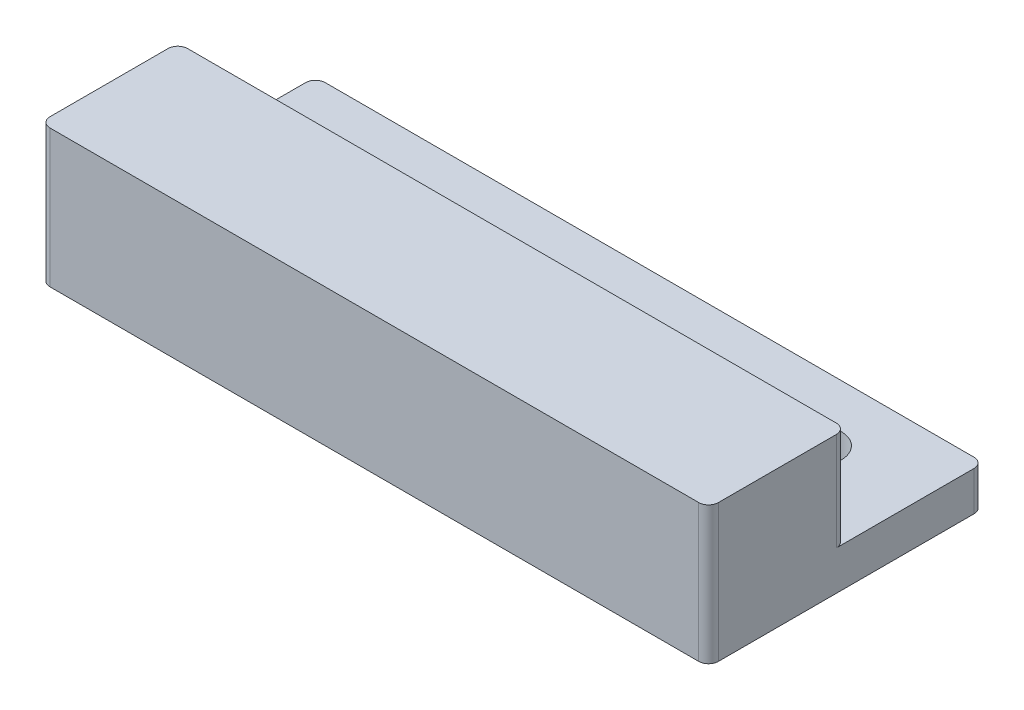
ISO-10303-21;
HEADER;
FILE_DESCRIPTION(('STEP AP214'),'2;1');
FILE_NAME('part.step','',(''),(''),'','','');
FILE_SCHEMA(('AUTOMOTIVE_DESIGN { 1 0 10303 214 1 1 1 1 }'));
ENDSEC;
DATA;
#1=APPLICATION_CONTEXT('core data for automotive mechanical design processes');
#2=APPLICATION_PROTOCOL_DEFINITION('international standard','automotive_design',2000,#1);
#3=PRODUCT_CONTEXT('',#1,'mechanical');
#4=PRODUCT('Part','Part','',(#3));
#5=PRODUCT_RELATED_PRODUCT_CATEGORY('part','',(#4));
#6=PRODUCT_DEFINITION_FORMATION('','',#4);
#7=PRODUCT_DEFINITION_CONTEXT('part definition',#1,'design');
#8=PRODUCT_DEFINITION('design','',#6,#7);
#9=PRODUCT_DEFINITION_SHAPE('','',#8);
#10=(LENGTH_UNIT() NAMED_UNIT(*) SI_UNIT(.MILLI.,.METRE.));
#11=(NAMED_UNIT(*) PLANE_ANGLE_UNIT() SI_UNIT($,.RADIAN.));
#12=(NAMED_UNIT(*) SI_UNIT($,.STERADIAN.) SOLID_ANGLE_UNIT());
#13=UNCERTAINTY_MEASURE_WITH_UNIT(LENGTH_MEASURE(1.E-05),#10,'distance_accuracy_value','');
#14=(GEOMETRIC_REPRESENTATION_CONTEXT(3) GLOBAL_UNCERTAINTY_ASSIGNED_CONTEXT((#13)) GLOBAL_UNIT_ASSIGNED_CONTEXT((#10,
#11,#12)) REPRESENTATION_CONTEXT('',''));
#15=CARTESIAN_POINT('',(0.,0.,0.));
#16=DIRECTION('',(0.,0.,1.));
#17=DIRECTION('',(1.,0.,0.));
#18=AXIS2_PLACEMENT_3D('',#15,#16,#17);
#19=CARTESIAN_POINT('',(17.,2.,-7.));
#20=DIRECTION('',(-1.,0.,0.));
#21=DIRECTION('',(0.,0.,1.));
#22=AXIS2_PLACEMENT_3D('',#19,#20,#21);
#23=PLANE('',#22);
#24=DIRECTION('',(0.,0.,-1.));
#25=VECTOR('',#24,1.);
#26=CARTESIAN_POINT('',(17.,2.,-7.));
#27=LINE('',#26,#25);
#28=CARTESIAN_POINT('',(17.,2.,0.499999999999999));
#29=VERTEX_POINT('',#28);
#30=CARTESIAN_POINT('',(17.,2.,-6.5));
#31=VERTEX_POINT('',#30);
#32=EDGE_CURVE('E159',#29,#31,#27,.T.);
#33=ORIENTED_EDGE('',*,*,#32,.F.);
#34=DIRECTION('',(0.,-1.,0.));
#35=VECTOR('',#34,1.);
#36=CARTESIAN_POINT('',(17.,2.,0.499999999999999));
#37=LINE('',#36,#35);
#38=CARTESIAN_POINT('',(17.,7.,0.499999999999999));
#39=VERTEX_POINT('',#38);
#40=EDGE_CURVE('E131',#29,#39,#37,.F.);
#41=ORIENTED_EDGE('',*,*,#40,.T.);
#42=DIRECTION('',(0.,0.,-1.));
#43=VECTOR('',#42,1.);
#44=CARTESIAN_POINT('',(17.,7.,7.));
#45=LINE('',#44,#43);
#46=CARTESIAN_POINT('',(17.,7.,6.5));
#47=VERTEX_POINT('',#46);
#48=EDGE_CURVE('E147',#47,#39,#45,.T.);
#49=ORIENTED_EDGE('',*,*,#48,.F.);
#50=DIRECTION('',(0.,-1.,0.));
#51=VECTOR('',#50,1.);
#52=CARTESIAN_POINT('',(17.,2.,6.5));
#53=LINE('',#52,#51);
#54=CARTESIAN_POINT('',(17.,0.,6.5));
#55=VERTEX_POINT('',#54);
#56=EDGE_CURVE('E142',#47,#55,#53,.T.);
#57=ORIENTED_EDGE('',*,*,#56,.T.);
#58=DIRECTION('',(0.,0.,-1.));
#59=VECTOR('',#58,1.);
#60=CARTESIAN_POINT('',(17.,0.,-7.));
#61=LINE('',#60,#59);
#62=CARTESIAN_POINT('',(17.,0.,-6.5));
#63=VERTEX_POINT('',#62);
#64=EDGE_CURVE('E166',#55,#63,#61,.T.);
#65=ORIENTED_EDGE('',*,*,#64,.T.);
#66=DIRECTION('',(0.,-1.,0.));
#67=VECTOR('',#66,1.);
#68=CARTESIAN_POINT('',(17.,2.,-6.5));
#69=LINE('',#68,#67);
#70=EDGE_CURVE('E179',#63,#31,#69,.F.);
#71=ORIENTED_EDGE('',*,*,#70,.T.);
#72=EDGE_LOOP('',(#33,#41,#49,#57,#65,#71));
#73=FACE_BOUND('',#72,.T.);
#74=ADVANCED_FACE('F36',(#73),#23,.F.);
#75=CARTESIAN_POINT('',(-17.,2.,-7.));
#76=DIRECTION('',(0.,0.,1.));
#77=DIRECTION('',(1.,0.,0.));
#78=AXIS2_PLACEMENT_3D('',#75,#76,#77);
#79=PLANE('',#78);
#80=DIRECTION('',(-1.,0.,0.));
#81=VECTOR('',#80,1.);
#82=CARTESIAN_POINT('',(-17.,0.,-7.));
#83=LINE('',#82,#81);
#84=CARTESIAN_POINT('',(16.5,0.,-7.));
#85=VERTEX_POINT('',#84);
#86=CARTESIAN_POINT('',(-16.5,0.,-7.));
#87=VERTEX_POINT('',#86);
#88=EDGE_CURVE('E169',#85,#87,#83,.T.);
#89=ORIENTED_EDGE('',*,*,#88,.T.);
#90=DIRECTION('',(0.,-1.,0.));
#91=VECTOR('',#90,1.);
#92=CARTESIAN_POINT('',(-16.5,2.,-7.));
#93=LINE('',#92,#91);
#94=CARTESIAN_POINT('',(-16.5,2.,-7.));
#95=VERTEX_POINT('',#94);
#96=EDGE_CURVE('E51',#87,#95,#93,.F.);
#97=ORIENTED_EDGE('',*,*,#96,.T.);
#98=DIRECTION('',(-1.,0.,0.));
#99=VECTOR('',#98,1.);
#100=CARTESIAN_POINT('',(-17.,2.,-7.));
#101=LINE('',#100,#99);
#102=CARTESIAN_POINT('',(16.5,2.,-7.));
#103=VERTEX_POINT('',#102);
#104=EDGE_CURVE('E161',#103,#95,#101,.T.);
#105=ORIENTED_EDGE('',*,*,#104,.F.);
#106=DIRECTION('',(0.,-1.,0.));
#107=VECTOR('',#106,1.);
#108=CARTESIAN_POINT('',(16.5,2.,-7.));
#109=LINE('',#108,#107);
#110=EDGE_CURVE('E211',#103,#85,#109,.T.);
#111=ORIENTED_EDGE('',*,*,#110,.T.);
#112=EDGE_LOOP('',(#89,#97,#105,#111));
#113=FACE_BOUND('',#112,.T.);
#114=ADVANCED_FACE('F230',(#113),#79,.F.);
#115=CARTESIAN_POINT('',(-17.,2.,-7.));
#116=DIRECTION('',(1.,0.,0.));
#117=DIRECTION('',(0.,0.,-1.));
#118=AXIS2_PLACEMENT_3D('',#115,#116,#117);
#119=PLANE('',#118);
#120=DIRECTION('',(0.,0.,1.));
#121=VECTOR('',#120,1.);
#122=CARTESIAN_POINT('',(-17.,7.,7.));
#123=LINE('',#122,#121);
#124=CARTESIAN_POINT('',(-17.,7.,0.499999999999999));
#125=VERTEX_POINT('',#124);
#126=CARTESIAN_POINT('',(-17.,7.,6.5));
#127=VERTEX_POINT('',#126);
#128=EDGE_CURVE('E252',#125,#127,#123,.T.);
#129=ORIENTED_EDGE('',*,*,#128,.F.);
#130=DIRECTION('',(0.,-1.,0.));
#131=VECTOR('',#130,1.);
#132=CARTESIAN_POINT('',(-17.,2.,0.499999999999999));
#133=LINE('',#132,#131);
#134=CARTESIAN_POINT('',(-17.,2.,0.499999999999999));
#135=VERTEX_POINT('',#134);
#136=EDGE_CURVE('E195',#125,#135,#133,.T.);
#137=ORIENTED_EDGE('',*,*,#136,.T.);
#138=DIRECTION('',(0.,0.,1.));
#139=VECTOR('',#138,1.);
#140=CARTESIAN_POINT('',(-17.,2.,-7.));
#141=LINE('',#140,#139);
#142=CARTESIAN_POINT('',(-17.,2.,-6.5));
#143=VERTEX_POINT('',#142);
#144=EDGE_CURVE('E164',#143,#135,#141,.T.);
#145=ORIENTED_EDGE('',*,*,#144,.F.);
#146=DIRECTION('',(0.,-1.,0.));
#147=VECTOR('',#146,1.);
#148=CARTESIAN_POINT('',(-17.,2.,-6.5));
#149=LINE('',#148,#147);
#150=CARTESIAN_POINT('',(-17.,0.,-6.5));
#151=VERTEX_POINT('',#150);
#152=EDGE_CURVE('E190',#143,#151,#149,.T.);
#153=ORIENTED_EDGE('',*,*,#152,.T.);
#154=DIRECTION('',(0.,0.,1.));
#155=VECTOR('',#154,1.);
#156=CARTESIAN_POINT('',(-17.,0.,-7.));
#157=LINE('',#156,#155);
#158=CARTESIAN_POINT('',(-17.,0.,6.5));
#159=VERTEX_POINT('',#158);
#160=EDGE_CURVE('E171',#151,#159,#157,.T.);
#161=ORIENTED_EDGE('',*,*,#160,.T.);
#162=DIRECTION('',(0.,-1.,0.));
#163=VECTOR('',#162,1.);
#164=CARTESIAN_POINT('',(-17.,2.,6.5));
#165=LINE('',#164,#163);
#166=EDGE_CURVE('E193',#159,#127,#165,.F.);
#167=ORIENTED_EDGE('',*,*,#166,.T.);
#168=EDGE_LOOP('',(#129,#137,#145,#153,#161,#167));
#169=FACE_BOUND('',#168,.T.);
#170=ADVANCED_FACE('F222',(#169),#119,.F.);
#171=CARTESIAN_POINT('',(-17.,2.,7.));
#172=DIRECTION('',(0.,0.,-1.));
#173=DIRECTION('',(-1.,0.,0.));
#174=AXIS2_PLACEMENT_3D('',#171,#172,#173);
#175=PLANE('',#174);
#176=DIRECTION('',(1.,0.,0.));
#177=VECTOR('',#176,1.);
#178=CARTESIAN_POINT('',(17.,7.,7.));
#179=LINE('',#178,#177);
#180=CARTESIAN_POINT('',(-16.5,7.,7.));
#181=VERTEX_POINT('',#180);
#182=CARTESIAN_POINT('',(16.5,7.,7.));
#183=VERTEX_POINT('',#182);
#184=EDGE_CURVE('E157',#181,#183,#179,.T.);
#185=ORIENTED_EDGE('',*,*,#184,.F.);
#186=DIRECTION('',(0.,-1.,0.));
#187=VECTOR('',#186,1.);
#188=CARTESIAN_POINT('',(-16.5,2.,7.));
#189=LINE('',#188,#187);
#190=CARTESIAN_POINT('',(-16.5,0.,7.));
#191=VERTEX_POINT('',#190);
#192=EDGE_CURVE('E200',#181,#191,#189,.T.);
#193=ORIENTED_EDGE('',*,*,#192,.T.);
#194=DIRECTION('',(1.,0.,0.));
#195=VECTOR('',#194,1.);
#196=CARTESIAN_POINT('',(-17.,0.,7.));
#197=LINE('',#196,#195);
#198=CARTESIAN_POINT('',(16.5,0.,7.));
#199=VERTEX_POINT('',#198);
#200=EDGE_CURVE('E162',#191,#199,#197,.T.);
#201=ORIENTED_EDGE('',*,*,#200,.T.);
#202=DIRECTION('',(0.,-1.,0.));
#203=VECTOR('',#202,1.);
#204=CARTESIAN_POINT('',(16.5,2.,7.));
#205=LINE('',#204,#203);
#206=EDGE_CURVE('E198',#199,#183,#205,.F.);
#207=ORIENTED_EDGE('',*,*,#206,.T.);
#208=EDGE_LOOP('',(#185,#193,#201,#207));
#209=FACE_BOUND('',#208,.T.);
#210=ADVANCED_FACE('F244',(#209),#175,.F.);
#211=CARTESIAN_POINT('',(0.,2.,0.));
#212=DIRECTION('',(0.,1.,0.));
#213=DIRECTION('',(0.,0.,1.));
#214=AXIS2_PLACEMENT_3D('',#211,#212,#213);
#215=PLANE('',#214);
#216=CARTESIAN_POINT('',(12.,2.,-3.5));
#217=DIRECTION('',(0.,1.,0.));
#218=DIRECTION('',(0.,0.,1.));
#219=AXIS2_PLACEMENT_3D('',#216,#217,#218);
#220=CIRCLE('',#219,1.25);
#221=CARTESIAN_POINT('',(12.,2.,-2.25));
#222=VERTEX_POINT('',#221);
#223=EDGE_CURVE('E153',#222,#222,#220,.T.);
#224=ORIENTED_EDGE('',*,*,#223,.F.);
#225=EDGE_LOOP('',(#224));
#226=FACE_BOUND('',#225,.T.);
#227=CARTESIAN_POINT('',(-12.,2.,-3.5));
#228=DIRECTION('',(0.,1.,0.));
#229=DIRECTION('',(0.,0.,-1.));
#230=AXIS2_PLACEMENT_3D('',#227,#228,#229);
#231=CIRCLE('',#230,1.25);
#232=CARTESIAN_POINT('',(-12.,2.,-4.75));
#233=VERTEX_POINT('',#232);
#234=EDGE_CURVE('E261',#233,#233,#231,.T.);
#235=ORIENTED_EDGE('',*,*,#234,.F.);
#236=EDGE_LOOP('',(#235));
#237=FACE_BOUND('',#236,.T.);
#238=ORIENTED_EDGE('',*,*,#104,.T.);
#239=CARTESIAN_POINT('',(-16.5,2.,-6.5));
#240=DIRECTION('',(0.,1.,0.));
#241=DIRECTION('',(0.,0.,1.));
#242=AXIS2_PLACEMENT_3D('',#239,#240,#241);
#243=CIRCLE('',#242,0.5);
#244=EDGE_CURVE('E133',#95,#143,#243,.T.);
#245=ORIENTED_EDGE('',*,*,#244,.T.);
#246=ORIENTED_EDGE('',*,*,#144,.T.);
#247=CARTESIAN_POINT('',(-16.5,2.,0.499999999999999));
#248=DIRECTION('',(0.,1.,0.));
#249=DIRECTION('',(0.,0.,1.));
#250=AXIS2_PLACEMENT_3D('',#247,#248,#249);
#251=CIRCLE('',#250,0.5);
#252=CARTESIAN_POINT('',(-16.5,2.,0.));
#253=VERTEX_POINT('',#252);
#254=EDGE_CURVE('E11',#135,#253,#251,.F.);
#255=ORIENTED_EDGE('',*,*,#254,.T.);
#256=DIRECTION('',(-1.,0.,0.));
#257=VECTOR('',#256,1.);
#258=CARTESIAN_POINT('',(17.,2.,0.));
#259=LINE('',#258,#257);
#260=CARTESIAN_POINT('',(16.5,2.,0.));
#261=VERTEX_POINT('',#260);
#262=EDGE_CURVE('E138',#261,#253,#259,.T.);
#263=ORIENTED_EDGE('',*,*,#262,.F.);
#264=CARTESIAN_POINT('',(16.5,2.,0.499999999999999));
#265=DIRECTION('',(0.,1.,0.));
#266=DIRECTION('',(0.,0.,1.));
#267=AXIS2_PLACEMENT_3D('',#264,#265,#266);
#268=CIRCLE('',#267,0.5);
#269=EDGE_CURVE('E44',#261,#29,#268,.F.);
#270=ORIENTED_EDGE('',*,*,#269,.T.);
#271=ORIENTED_EDGE('',*,*,#32,.T.);
#272=CARTESIAN_POINT('',(16.5,2.,-6.5));
#273=DIRECTION('',(0.,1.,0.));
#274=DIRECTION('',(0.,0.,1.));
#275=AXIS2_PLACEMENT_3D('',#272,#273,#274);
#276=CIRCLE('',#275,0.5);
#277=EDGE_CURVE('E58',#31,#103,#276,.T.);
#278=ORIENTED_EDGE('',*,*,#277,.T.);
#279=EDGE_LOOP('',(#238,#245,#246,#255,#263,#270,#271,#278));
#280=FACE_BOUND('',#279,.T.);
#281=ADVANCED_FACE('F145',(#226,#237,#280),#215,.T.);
#282=CARTESIAN_POINT('',(0.,0.,0.));
#283=DIRECTION('',(0.,1.,0.));
#284=DIRECTION('',(0.,0.,1.));
#285=AXIS2_PLACEMENT_3D('',#282,#283,#284);
#286=PLANE('',#285);
#287=CARTESIAN_POINT('',(12.,0.,-3.5));
#288=DIRECTION('',(0.,1.,0.));
#289=DIRECTION('',(0.,0.,1.));
#290=AXIS2_PLACEMENT_3D('',#287,#288,#289);
#291=CIRCLE('',#290,1.25);
#292=CARTESIAN_POINT('',(12.,0.,-2.25));
#293=VERTEX_POINT('',#292);
#294=EDGE_CURVE('E148',#293,#293,#291,.F.);
#295=ORIENTED_EDGE('',*,*,#294,.F.);
#296=EDGE_LOOP('',(#295));
#297=FACE_BOUND('',#296,.T.);
#298=CARTESIAN_POINT('',(-12.,0.,-3.5));
#299=DIRECTION('',(0.,1.,0.));
#300=DIRECTION('',(0.,0.,1.));
#301=AXIS2_PLACEMENT_3D('',#298,#299,#300);
#302=CIRCLE('',#301,1.25);
#303=CARTESIAN_POINT('',(-12.,0.,-2.25));
#304=VERTEX_POINT('',#303);
#305=EDGE_CURVE('E258',#304,#304,#302,.F.);
#306=ORIENTED_EDGE('',*,*,#305,.F.);
#307=EDGE_LOOP('',(#306));
#308=FACE_BOUND('',#307,.T.);
#309=ORIENTED_EDGE('',*,*,#200,.F.);
#310=CARTESIAN_POINT('',(-16.5,0.,6.5));
#311=DIRECTION('',(0.,1.,0.));
#312=DIRECTION('',(0.,0.,1.));
#313=AXIS2_PLACEMENT_3D('',#310,#311,#312);
#314=CIRCLE('',#313,0.5);
#315=EDGE_CURVE('E209',#191,#159,#314,.F.);
#316=ORIENTED_EDGE('',*,*,#315,.T.);
#317=ORIENTED_EDGE('',*,*,#160,.F.);
#318=CARTESIAN_POINT('',(-16.5,0.,-6.5));
#319=DIRECTION('',(0.,1.,0.));
#320=DIRECTION('',(0.,0.,1.));
#321=AXIS2_PLACEMENT_3D('',#318,#319,#320);
#322=CIRCLE('',#321,0.5);
#323=EDGE_CURVE('E207',#151,#87,#322,.F.);
#324=ORIENTED_EDGE('',*,*,#323,.T.);
#325=ORIENTED_EDGE('',*,*,#88,.F.);
#326=CARTESIAN_POINT('',(16.5,0.,-6.5));
#327=DIRECTION('',(0.,1.,0.));
#328=DIRECTION('',(0.,0.,1.));
#329=AXIS2_PLACEMENT_3D('',#326,#327,#328);
#330=CIRCLE('',#329,0.5);
#331=EDGE_CURVE('E205',#85,#63,#330,.F.);
#332=ORIENTED_EDGE('',*,*,#331,.T.);
#333=ORIENTED_EDGE('',*,*,#64,.F.);
#334=CARTESIAN_POINT('',(16.5,0.,6.5));
#335=DIRECTION('',(0.,1.,0.));
#336=DIRECTION('',(0.,0.,1.));
#337=AXIS2_PLACEMENT_3D('',#334,#335,#336);
#338=CIRCLE('',#337,0.5);
#339=EDGE_CURVE('E203',#55,#199,#338,.F.);
#340=ORIENTED_EDGE('',*,*,#339,.T.);
#341=EDGE_LOOP('',(#309,#316,#317,#324,#325,#332,#333,#340));
#342=FACE_BOUND('',#341,.T.);
#343=ADVANCED_FACE('F229',(#297,#308,#342),#286,.F.);
#344=CARTESIAN_POINT('',(17.,7.,0.));
#345=DIRECTION('',(0.,0.,1.));
#346=DIRECTION('',(1.,0.,0.));
#347=AXIS2_PLACEMENT_3D('',#344,#345,#346);
#348=PLANE('',#347);
#349=DIRECTION('',(-1.,0.,0.));
#350=VECTOR('',#349,1.);
#351=CARTESIAN_POINT('',(17.,7.,0.));
#352=LINE('',#351,#350);
#353=CARTESIAN_POINT('',(16.5,7.,0.));
#354=VERTEX_POINT('',#353);
#355=CARTESIAN_POINT('',(-16.5,7.,0.));
#356=VERTEX_POINT('',#355);
#357=EDGE_CURVE('E141',#354,#356,#352,.T.);
#358=ORIENTED_EDGE('',*,*,#357,.F.);
#359=DIRECTION('',(0.,-1.,0.));
#360=VECTOR('',#359,1.);
#361=CARTESIAN_POINT('',(16.5,7.,0.));
#362=LINE('',#361,#360);
#363=EDGE_CURVE('E130',#354,#261,#362,.T.);
#364=ORIENTED_EDGE('',*,*,#363,.T.);
#365=ORIENTED_EDGE('',*,*,#262,.T.);
#366=DIRECTION('',(0.,-1.,0.));
#367=VECTOR('',#366,1.);
#368=CARTESIAN_POINT('',(-16.5,7.,0.));
#369=LINE('',#368,#367);
#370=EDGE_CURVE('E143',#253,#356,#369,.F.);
#371=ORIENTED_EDGE('',*,*,#370,.T.);
#372=EDGE_LOOP('',(#358,#364,#365,#371));
#373=FACE_BOUND('',#372,.T.);
#374=ADVANCED_FACE('F137',(#373),#348,.F.);
#375=CARTESIAN_POINT('',(0.,7.,0.));
#376=DIRECTION('',(0.,1.,0.));
#377=DIRECTION('',(0.,0.,1.));
#378=AXIS2_PLACEMENT_3D('',#375,#376,#377);
#379=PLANE('',#378);
#380=ORIENTED_EDGE('',*,*,#48,.T.);
#381=CARTESIAN_POINT('',(16.5,7.,0.499999999999999));
#382=DIRECTION('',(0.,1.,0.));
#383=DIRECTION('',(0.,0.,1.));
#384=AXIS2_PLACEMENT_3D('',#381,#382,#383);
#385=CIRCLE('',#384,0.5);
#386=EDGE_CURVE('E188',#39,#354,#385,.T.);
#387=ORIENTED_EDGE('',*,*,#386,.T.);
#388=ORIENTED_EDGE('',*,*,#357,.T.);
#389=CARTESIAN_POINT('',(-16.5,7.,0.499999999999999));
#390=DIRECTION('',(0.,1.,0.));
#391=DIRECTION('',(0.,0.,1.));
#392=AXIS2_PLACEMENT_3D('',#389,#390,#391);
#393=CIRCLE('',#392,0.5);
#394=EDGE_CURVE('E186',#356,#125,#393,.T.);
#395=ORIENTED_EDGE('',*,*,#394,.T.);
#396=ORIENTED_EDGE('',*,*,#128,.T.);
#397=CARTESIAN_POINT('',(-16.5,7.,6.5));
#398=DIRECTION('',(0.,1.,0.));
#399=DIRECTION('',(0.,0.,1.));
#400=AXIS2_PLACEMENT_3D('',#397,#398,#399);
#401=CIRCLE('',#400,0.5);
#402=EDGE_CURVE('E184',#127,#181,#401,.T.);
#403=ORIENTED_EDGE('',*,*,#402,.T.);
#404=ORIENTED_EDGE('',*,*,#184,.T.);
#405=CARTESIAN_POINT('',(16.5,7.,6.5));
#406=DIRECTION('',(0.,1.,0.));
#407=DIRECTION('',(0.,0.,1.));
#408=AXIS2_PLACEMENT_3D('',#405,#406,#407);
#409=CIRCLE('',#408,0.5);
#410=EDGE_CURVE('E182',#183,#47,#409,.T.);
#411=ORIENTED_EDGE('',*,*,#410,.T.);
#412=EDGE_LOOP('',(#380,#387,#388,#395,#396,#403,#404,#411));
#413=FACE_BOUND('',#412,.T.);
#414=ADVANCED_FACE('F254',(#413),#379,.T.);
#415=CARTESIAN_POINT('',(16.5,7.,0.499999999999999));
#416=DIRECTION('',(0.,-1.,0.));
#417=DIRECTION('',(0.,0.,-1.));
#418=AXIS2_PLACEMENT_3D('',#415,#416,#417);
#419=CYLINDRICAL_SURFACE('',#418,0.5);
#420=ORIENTED_EDGE('',*,*,#386,.F.);
#421=ORIENTED_EDGE('',*,*,#40,.F.);
#422=ORIENTED_EDGE('',*,*,#269,.F.);
#423=ORIENTED_EDGE('',*,*,#363,.F.);
#424=EDGE_LOOP('',(#420,#421,#422,#423));
#425=FACE_BOUND('',#424,.T.);
#426=ADVANCED_FACE('F129',(#425),#419,.T.);
#427=CARTESIAN_POINT('',(-16.5,2.,0.499999999999999));
#428=DIRECTION('',(0.,-1.,0.));
#429=DIRECTION('',(0.,0.,-1.));
#430=AXIS2_PLACEMENT_3D('',#427,#428,#429);
#431=CYLINDRICAL_SURFACE('',#430,0.5);
#432=ORIENTED_EDGE('',*,*,#394,.F.);
#433=ORIENTED_EDGE('',*,*,#370,.F.);
#434=ORIENTED_EDGE('',*,*,#254,.F.);
#435=ORIENTED_EDGE('',*,*,#136,.F.);
#436=EDGE_LOOP('',(#432,#433,#434,#435));
#437=FACE_BOUND('',#436,.T.);
#438=ADVANCED_FACE('F300',(#437),#431,.T.);
#439=CARTESIAN_POINT('',(-16.5,2.,6.5));
#440=DIRECTION('',(0.,-1.,0.));
#441=DIRECTION('',(0.,0.,-1.));
#442=AXIS2_PLACEMENT_3D('',#439,#440,#441);
#443=CYLINDRICAL_SURFACE('',#442,0.5);
#444=ORIENTED_EDGE('',*,*,#402,.F.);
#445=ORIENTED_EDGE('',*,*,#166,.F.);
#446=ORIENTED_EDGE('',*,*,#315,.F.);
#447=ORIENTED_EDGE('',*,*,#192,.F.);
#448=EDGE_LOOP('',(#444,#445,#446,#447));
#449=FACE_BOUND('',#448,.T.);
#450=ADVANCED_FACE('F249',(#449),#443,.T.);
#451=CARTESIAN_POINT('',(-16.5,2.,-6.5));
#452=DIRECTION('',(0.,-1.,0.));
#453=DIRECTION('',(0.,0.,-1.));
#454=AXIS2_PLACEMENT_3D('',#451,#452,#453);
#455=CYLINDRICAL_SURFACE('',#454,0.5);
#456=ORIENTED_EDGE('',*,*,#244,.F.);
#457=ORIENTED_EDGE('',*,*,#96,.F.);
#458=ORIENTED_EDGE('',*,*,#323,.F.);
#459=ORIENTED_EDGE('',*,*,#152,.F.);
#460=EDGE_LOOP('',(#456,#457,#458,#459));
#461=FACE_BOUND('',#460,.T.);
#462=ADVANCED_FACE('F225',(#461),#455,.T.);
#463=CARTESIAN_POINT('',(16.5,2.,-6.5));
#464=DIRECTION('',(0.,-1.,0.));
#465=DIRECTION('',(0.,0.,-1.));
#466=AXIS2_PLACEMENT_3D('',#463,#464,#465);
#467=CYLINDRICAL_SURFACE('',#466,0.5);
#468=ORIENTED_EDGE('',*,*,#277,.F.);
#469=ORIENTED_EDGE('',*,*,#70,.F.);
#470=ORIENTED_EDGE('',*,*,#331,.F.);
#471=ORIENTED_EDGE('',*,*,#110,.F.);
#472=EDGE_LOOP('',(#468,#469,#470,#471));
#473=FACE_BOUND('',#472,.T.);
#474=ADVANCED_FACE('F233',(#473),#467,.T.);
#475=CARTESIAN_POINT('',(16.5,2.,6.5));
#476=DIRECTION('',(0.,-1.,0.));
#477=DIRECTION('',(0.,0.,-1.));
#478=AXIS2_PLACEMENT_3D('',#475,#476,#477);
#479=CYLINDRICAL_SURFACE('',#478,0.5);
#480=ORIENTED_EDGE('',*,*,#410,.F.);
#481=ORIENTED_EDGE('',*,*,#206,.F.);
#482=ORIENTED_EDGE('',*,*,#339,.F.);
#483=ORIENTED_EDGE('',*,*,#56,.F.);
#484=EDGE_LOOP('',(#480,#481,#482,#483));
#485=FACE_BOUND('',#484,.T.);
#486=ADVANCED_FACE('F38',(#485),#479,.T.);
#487=CARTESIAN_POINT('',(-12.,-0.00100000000000013,-3.5));
#488=DIRECTION('',(0.,1.,0.));
#489=DIRECTION('',(0.,0.,1.));
#490=AXIS2_PLACEMENT_3D('',#487,#488,#489);
#491=CYLINDRICAL_SURFACE('',#490,1.25);
#492=ORIENTED_EDGE('',*,*,#234,.T.);
#493=EDGE_LOOP('',(#492));
#494=FACE_BOUND('',#493,.T.);
#495=ORIENTED_EDGE('',*,*,#305,.T.);
#496=EDGE_LOOP('',(#495));
#497=FACE_BOUND('',#496,.T.);
#498=ADVANCED_FACE('F275',(#494,#497),#491,.F.);
#499=CARTESIAN_POINT('',(12.,-0.00100000000000013,-3.5));
#500=DIRECTION('',(0.,1.,0.));
#501=DIRECTION('',(0.,0.,1.));
#502=AXIS2_PLACEMENT_3D('',#499,#500,#501);
#503=CYLINDRICAL_SURFACE('',#502,1.25);
#504=ORIENTED_EDGE('',*,*,#223,.T.);
#505=EDGE_LOOP('',(#504));
#506=FACE_BOUND('',#505,.T.);
#507=ORIENTED_EDGE('',*,*,#294,.T.);
#508=EDGE_LOOP('',(#507));
#509=FACE_BOUND('',#508,.T.);
#510=ADVANCED_FACE('F267',(#506,#509),#503,.F.);
#511=CLOSED_SHELL('',(#74,#114,#170,#210,#281,#343,#374,#414,#426,#438,#450,#462,#474,#486,#498,#510));
#512=MANIFOLD_SOLID_BREP('B2',#511);
#513=ADVANCED_BREP_SHAPE_REPRESENTATION('',(#18,#512),#14);
#514=SHAPE_DEFINITION_REPRESENTATION(#9,#513);
ENDSEC;
END-ISO-10303-21;
